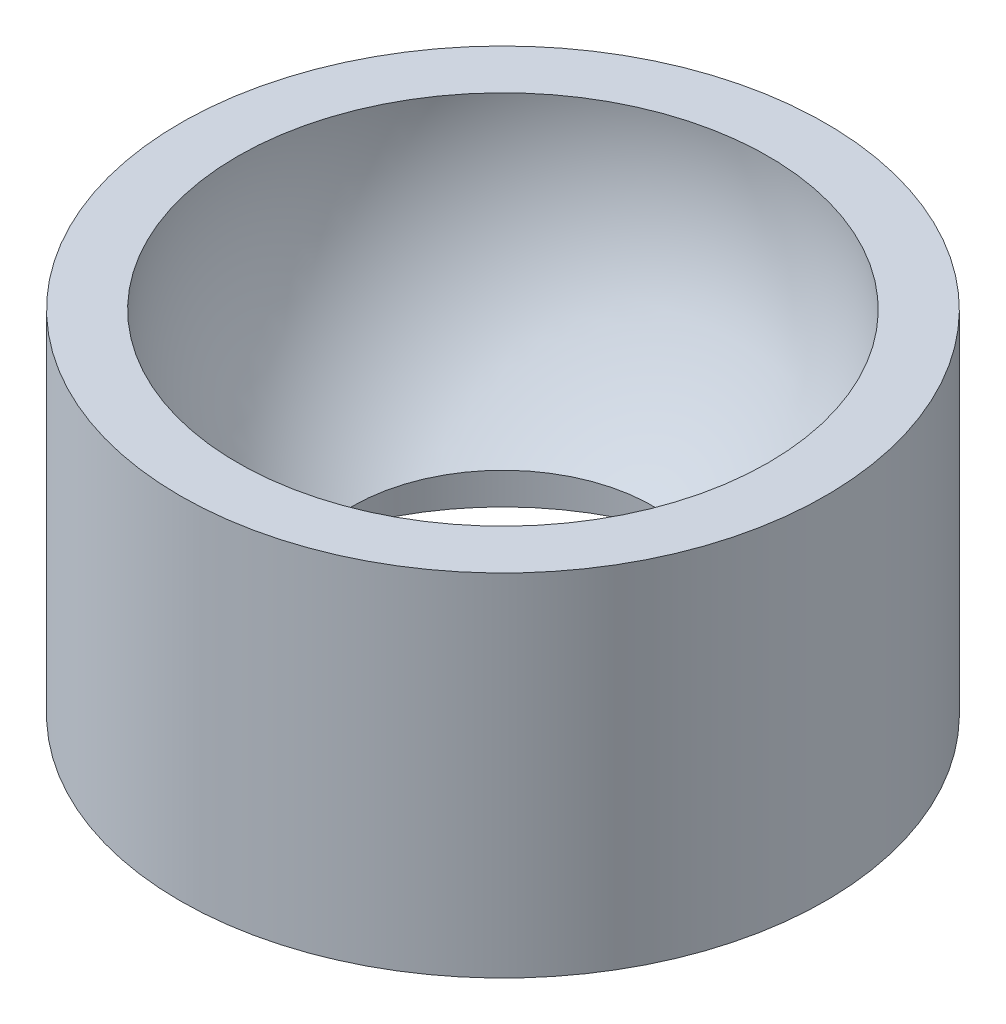
ISO-10303-21;
HEADER;
FILE_DESCRIPTION(('STEP AP214'),'2;1');
FILE_NAME('part.step','',(''),(''),'','','');
FILE_SCHEMA(('AUTOMOTIVE_DESIGN { 1 0 10303 214 1 1 1 1 }'));
ENDSEC;
DATA;
#1=APPLICATION_CONTEXT('core data for automotive mechanical design processes');
#2=APPLICATION_PROTOCOL_DEFINITION('international standard','automotive_design',2000,#1);
#3=PRODUCT_CONTEXT('',#1,'mechanical');
#4=PRODUCT('Part','Part','',(#3));
#5=PRODUCT_RELATED_PRODUCT_CATEGORY('part','',(#4));
#6=PRODUCT_DEFINITION_FORMATION('','',#4);
#7=PRODUCT_DEFINITION_CONTEXT('part definition',#1,'design');
#8=PRODUCT_DEFINITION('design','',#6,#7);
#9=PRODUCT_DEFINITION_SHAPE('','',#8);
#10=(LENGTH_UNIT() NAMED_UNIT(*) SI_UNIT(.MILLI.,.METRE.));
#11=(NAMED_UNIT(*) PLANE_ANGLE_UNIT() SI_UNIT($,.RADIAN.));
#12=(NAMED_UNIT(*) SI_UNIT($,.STERADIAN.) SOLID_ANGLE_UNIT());
#13=UNCERTAINTY_MEASURE_WITH_UNIT(LENGTH_MEASURE(1.E-05),#10,'distance_accuracy_value','');
#14=(GEOMETRIC_REPRESENTATION_CONTEXT(3) GLOBAL_UNCERTAINTY_ASSIGNED_CONTEXT((#13)) GLOBAL_UNIT_ASSIGNED_CONTEXT((#10,
#11,#12)) REPRESENTATION_CONTEXT('',''));
#15=CARTESIAN_POINT('',(0.,0.,0.));
#16=DIRECTION('',(0.,0.,1.));
#17=DIRECTION('',(1.,0.,0.));
#18=AXIS2_PLACEMENT_3D('',#15,#16,#17);
#19=CARTESIAN_POINT('',(0.,92.7444240281181,0.));
#20=DIRECTION('',(0.,-1.,0.));
#21=DIRECTION('',(-1.,0.,0.));
#22=AXIS2_PLACEMENT_3D('',#19,#20,#21);
#23=SPHERICAL_SURFACE('',#22,76.);
#24=CARTESIAN_POINT('',(0.,100.,0.));
#25=DIRECTION('',(0.,1.,0.));
#26=DIRECTION('',(0.,0.,1.));
#27=AXIS2_PLACEMENT_3D('',#24,#25,#26);
#28=CIRCLE('',#27,75.65286919421);
#29=CARTESIAN_POINT('',(-75.65286919421,100.,0.));
#30=VERTEX_POINT('',#29);
#31=EDGE_CURVE('E56',#30,#30,#28,.F.);
#32=CARTESIAN_POINT('',(0.,30.,0.));
#33=DIRECTION('',(0.,-1.,0.));
#34=DIRECTION('',(0.,0.,-1.));
#35=AXIS2_PLACEMENT_3D('',#32,#33,#34);
#36=CIRCLE('',#35,42.8851635578054);
#37=CARTESIAN_POINT('',(-42.8851635578054,30.,0.));
#38=VERTEX_POINT('',#37);
#39=EDGE_CURVE('E45',#38,#38,#36,.T.);
#40=CARTESIAN_POINT('',(-75.65286919421,100.,0.));
#41=CARTESIAN_POINT('',(-75.7335062465782,99.1592676392999,0.));
#42=CARTESIAN_POINT('',(-75.8001176523582,98.3171904586705,0.));
#43=CARTESIAN_POINT('',(-75.9052397703696,96.6312838714946,0.));
#44=CARTESIAN_POINT('',(-75.9437504826011,95.7874544649482,0.));
#45=CARTESIAN_POINT('',(-75.9926218131432,94.0989808398805,0.));
#46=CARTESIAN_POINT('',(-76.0029824314539,93.2543366213591,0.));
#47=CARTESIAN_POINT('',(-75.9955438278718,91.5651722136662,0.));
#48=CARTESIAN_POINT('',(-75.9777446059791,90.7206520244945,0.));
#49=CARTESIAN_POINT('',(-75.9140056300586,89.0326742391627,0.));
#50=CARTESIAN_POINT('',(-75.868065876031,88.1892166430024,0.));
#51=CARTESIAN_POINT('',(-75.7480970198957,86.5043014638614,0.));
#52=CARTESIAN_POINT('',(-75.6740679177881,85.6628438808805,0.));
#53=CARTESIAN_POINT('',(-75.4980026068438,83.9828639154287,0.));
#54=CARTESIAN_POINT('',(-75.3959663980071,83.1443415329577,0.));
#55=CARTESIAN_POINT('',(-75.164000284974,81.4711638963866,0.));
#56=CARTESIAN_POINT('',(-75.0340703807776,80.6365086422865,0.));
#57=CARTESIAN_POINT('',(-74.7464612776736,78.9719928917009,0.));
#58=CARTESIAN_POINT('',(-74.588782078766,78.1421323952155,0.));
#59=CARTESIAN_POINT('',(-74.2458496303364,76.4881284604395,0.));
#60=CARTESIAN_POINT('',(-74.0605963808144,75.663985022149,0.));
#61=CARTESIAN_POINT('',(-73.66272172001,74.0223311503972,0.));
#62=CARTESIAN_POINT('',(-73.4501003087276,73.204820716936,0.));
#63=CARTESIAN_POINT('',(-72.9977256302419,71.5773414296207,0.));
#64=CARTESIAN_POINT('',(-72.7579723630385,70.7673725757666,0.));
#65=CARTESIAN_POINT('',(-72.2516004326258,69.1558766407865,0.));
#66=CARTESIAN_POINT('',(-71.9849817694164,68.3543495596605,0.));
#67=CARTESIAN_POINT('',(-71.4251753649158,66.7606279811375,0.));
#68=CARTESIAN_POINT('',(-71.1319876236246,65.9684334837405,0.));
#69=CARTESIAN_POINT('',(-70.5193689095483,64.3942575115149,0.));
#70=CARTESIAN_POINT('',(-70.1999379367632,63.6122760366863,0.));
#71=CARTESIAN_POINT('',(-69.5351877728128,62.0593951977624,0.));
#72=CARTESIAN_POINT('',(-69.1898685816474,61.2884958336671,0.));
#73=CARTESIAN_POINT('',(-68.4737257660155,59.7586359878029,0.));
#74=CARTESIAN_POINT('',(-68.1029021415489,58.9996755060338,0.));
#75=CARTESIAN_POINT('',(-67.3361625898237,57.4945369276334,0.));
#76=CARTESIAN_POINT('',(-66.9402466625651,56.7483588310019,0.));
#77=CARTESIAN_POINT('',(-66.1237625231562,55.269614319444,0.));
#78=CARTESIAN_POINT('',(-65.7031943110058,54.5370479045176,0.));
#79=CARTESIAN_POINT('',(-64.8378730180732,53.0863409250186,0.));
#80=CARTESIAN_POINT('',(-64.3931199372908,52.3682003604461,0.));
#81=CARTESIAN_POINT('',(-63.4799232022275,50.9471432175285,0.));
#82=CARTESIAN_POINT('',(-63.0114795479465,50.2442266391835,0.));
#83=CARTESIAN_POINT('',(-62.0514222905488,48.8543986847614,0.));
#84=CARTESIAN_POINT('',(-61.559808687432,48.1674873086842,0.));
#85=CARTESIAN_POINT('',(-60.5539579078923,46.8104331868279,0.));
#86=CARTESIAN_POINT('',(-60.0397207314694,46.1402904410488,0.));
#87=CARTESIAN_POINT('',(-58.9891943246434,44.8175183711133,0.));
#88=CARTESIAN_POINT('',(-58.4529050942402,44.1648890469569,0.));
#89=CARTESIAN_POINT('',(-57.3588706067699,42.8778691479804,0.));
#90=CARTESIAN_POINT('',(-56.8011253497028,42.2434785731603,0.));
#91=CARTESIAN_POINT('',(-55.6647986841185,40.9936412276632,0.));
#92=CARTESIAN_POINT('',(-55.0862172756013,40.378194456986,0.));
#93=CARTESIAN_POINT('',(-53.9088613326186,39.1669287299217,0.));
#94=CARTESIAN_POINT('',(-53.3100867981531,38.5711097735345,0.));
#95=CARTESIAN_POINT('',(-52.0930100968234,37.3997618361466,0.));
#96=CARTESIAN_POINT('',(-51.4747079299594,36.8242328551458,0.));
#97=CARTESIAN_POINT('',(-50.2192630648353,35.6941046095653,0.));
#98=CARTESIAN_POINT('',(-49.5821203665753,35.1395053449855,0.));
#99=CARTESIAN_POINT('',(-48.2897028349465,34.0518525267671,0.));
#100=CARTESIAN_POINT('',(-47.6344280015777,33.5187989731284,0.));
#101=CARTESIAN_POINT('',(-46.3064734190859,32.4748314370732,0.));
#102=CARTESIAN_POINT('',(-45.6337936699629,31.9639174546565,0.));
#103=CARTESIAN_POINT('',(-44.2717807783313,30.9647915549785,0.));
#104=CARTESIAN_POINT('',(-43.5824476358227,30.4765796377171,0.));
#105=CARTESIAN_POINT('',(-42.8851635578054,30.,0.));
#106=B_SPLINE_CURVE_WITH_KNOTS('',3,(#40,#41,#42,#43,#44,#45,#46,#47,#48,#49,#50,#51,#52,#53,
#54,#55,#56,#57,#58,#59,#60,#61,#62,#63,#64,#65,#66,#67,#68,#69,#70,#71,#72,#73,#74,#75,#76,#77,
#78,#79,#80,#81,#82,#83,#84,#85,#86,#87,#88,#89,#90,#91,#92,#93,#94,#95,#96,#97,#98,#99,#100,
#101,#102,#103,#104,#105),.UNSPECIFIED.,.F.,.F.,(4,2,2,2,2,2,2,2,2,2,2,2,2,2,2,2,2,2,2,2,2,2,2,
2,2,2,2,2,2,2,2,2,4),(0.,2.53365383219487,5.06730766438973,7.60096149658461,10.1346153287795,
12.6682691609743,15.2019229931692,17.7355768253641,20.2692306575589,22.8028844897538,
25.3365383219487,27.8701921541435,30.4038459863384,32.9374998185333,35.4711536507281,
38.004807482923,40.5384613151179,43.0721151473127,45.6057689795076,48.1394228117025,
50.6730766438973,53.2067304760922,55.7403843082871,58.2740381404819,60.8076919726768,
63.3413458048717,65.8749996370665,68.4086534692614,70.9423073014562,73.4759611336511,
76.009614965846,78.5432687980409,81.0769226302357),.UNSPECIFIED.);
#107=EDGE_CURVE('BSEAM41',#30,#38,#106,.T.);
#108=ORIENTED_EDGE('',*,*,#31,.F.);
#109=ORIENTED_EDGE('',*,*,#39,.T.);
#110=ORIENTED_EDGE('',*,*,#107,.T.);
#111=ORIENTED_EDGE('',*,*,#107,.F.);
#112=EDGE_LOOP('',(#108,#110,#109,#111));
#113=FACE_BOUND('',#112,.T.);
#114=ADVANCED_FACE('F41',(#113),#23,.F.);
#115=CARTESIAN_POINT('',(0.,100.,0.));
#116=DIRECTION('',(0.,-1.,0.));
#117=DIRECTION('',(0.,0.,-1.));
#118=AXIS2_PLACEMENT_3D('',#115,#116,#117);
#119=CYLINDRICAL_SURFACE('',#118,92.);
#120=CARTESIAN_POINT('',(0.,100.,0.));
#121=DIRECTION('',(0.,1.,0.));
#122=DIRECTION('',(0.,0.,1.));
#123=AXIS2_PLACEMENT_3D('',#120,#121,#122);
#124=CIRCLE('',#123,92.);
#125=CARTESIAN_POINT('',(0.,100.,92.));
#126=VERTEX_POINT('',#125);
#127=EDGE_CURVE('E10',#126,#126,#124,.T.);
#128=ORIENTED_EDGE('',*,*,#127,.F.);
#129=EDGE_LOOP('',(#128));
#130=FACE_BOUND('',#129,.T.);
#131=CARTESIAN_POINT('',(0.,0.,0.));
#132=DIRECTION('',(0.,1.,0.));
#133=DIRECTION('',(0.,0.,1.));
#134=AXIS2_PLACEMENT_3D('',#131,#132,#133);
#135=CIRCLE('',#134,92.);
#136=CARTESIAN_POINT('',(0.,0.,92.));
#137=VERTEX_POINT('',#136);
#138=EDGE_CURVE('E50',#137,#137,#135,.T.);
#139=ORIENTED_EDGE('',*,*,#138,.T.);
#140=EDGE_LOOP('',(#139));
#141=FACE_BOUND('',#140,.T.);
#142=ADVANCED_FACE('F43',(#130,#141),#119,.T.);
#143=CARTESIAN_POINT('',(0.,100.,0.));
#144=DIRECTION('',(0.,1.,0.));
#145=DIRECTION('',(0.,0.,1.));
#146=AXIS2_PLACEMENT_3D('',#143,#144,#145);
#147=PLANE('',#146);
#148=ORIENTED_EDGE('',*,*,#31,.T.);
#149=EDGE_LOOP('',(#148));
#150=FACE_BOUND('',#149,.T.);
#151=ORIENTED_EDGE('',*,*,#127,.T.);
#152=EDGE_LOOP('',(#151));
#153=FACE_BOUND('',#152,.T.);
#154=ADVANCED_FACE('F83',(#150,#153),#147,.T.);
#155=CARTESIAN_POINT('',(0.,0.,0.));
#156=DIRECTION('',(0.,1.,0.));
#157=DIRECTION('',(0.,0.,1.));
#158=AXIS2_PLACEMENT_3D('',#155,#156,#157);
#159=PLANE('',#158);
#160=CARTESIAN_POINT('',(0.,0.,0.));
#161=DIRECTION('',(0.,-1.,0.));
#162=DIRECTION('',(0.,0.,-1.));
#163=AXIS2_PLACEMENT_3D('',#160,#161,#162);
#164=CIRCLE('',#163,72.5);
#165=CARTESIAN_POINT('',(0.,0.,-72.5));
#166=VERTEX_POINT('',#165);
#167=EDGE_CURVE('E59',#166,#166,#164,.T.);
#168=ORIENTED_EDGE('',*,*,#167,.F.);
#169=EDGE_LOOP('',(#168));
#170=FACE_BOUND('',#169,.T.);
#171=ORIENTED_EDGE('',*,*,#138,.F.);
#172=EDGE_LOOP('',(#171));
#173=FACE_BOUND('',#172,.T.);
#174=ADVANCED_FACE('F80',(#170,#173),#159,.F.);
#175=CARTESIAN_POINT('',(0.,30.,0.));
#176=DIRECTION('',(0.,-1.,0.));
#177=DIRECTION('',(0.,0.,-1.));
#178=AXIS2_PLACEMENT_3D('',#175,#176,#177);
#179=CYLINDRICAL_SURFACE('',#178,72.5);
#180=CARTESIAN_POINT('',(0.,30.,0.));
#181=DIRECTION('',(0.,-1.,0.));
#182=DIRECTION('',(0.,0.,-1.));
#183=AXIS2_PLACEMENT_3D('',#180,#181,#182);
#184=CIRCLE('',#183,72.5);
#185=CARTESIAN_POINT('',(0.,30.,-72.5));
#186=VERTEX_POINT('',#185);
#187=EDGE_CURVE('E67',#186,#186,#184,.T.);
#188=ORIENTED_EDGE('',*,*,#187,.F.);
#189=EDGE_LOOP('',(#188));
#190=FACE_BOUND('',#189,.T.);
#191=ORIENTED_EDGE('',*,*,#167,.T.);
#192=EDGE_LOOP('',(#191));
#193=FACE_BOUND('',#192,.T.);
#194=ADVANCED_FACE('F78',(#190,#193),#179,.F.);
#195=CARTESIAN_POINT('',(0.,30.,0.));
#196=DIRECTION('',(0.,-1.,0.));
#197=DIRECTION('',(0.,0.,-1.));
#198=AXIS2_PLACEMENT_3D('',#195,#196,#197);
#199=PLANE('',#198);
#200=ORIENTED_EDGE('',*,*,#39,.F.);
#201=EDGE_LOOP('',(#200));
#202=FACE_BOUND('',#201,.T.);
#203=ORIENTED_EDGE('',*,*,#187,.T.);
#204=EDGE_LOOP('',(#203));
#205=FACE_BOUND('',#204,.T.);
#206=ADVANCED_FACE('F100',(#202,#205),#199,.T.);
#207=CLOSED_SHELL('',(#114,#142,#154,#174,#194,#206));
#208=MANIFOLD_SOLID_BREP('B2',#207);
#209=ADVANCED_BREP_SHAPE_REPRESENTATION('',(#18,#208),#14);
#210=SHAPE_DEFINITION_REPRESENTATION(#9,#209);
ENDSEC;
END-ISO-10303-21;
